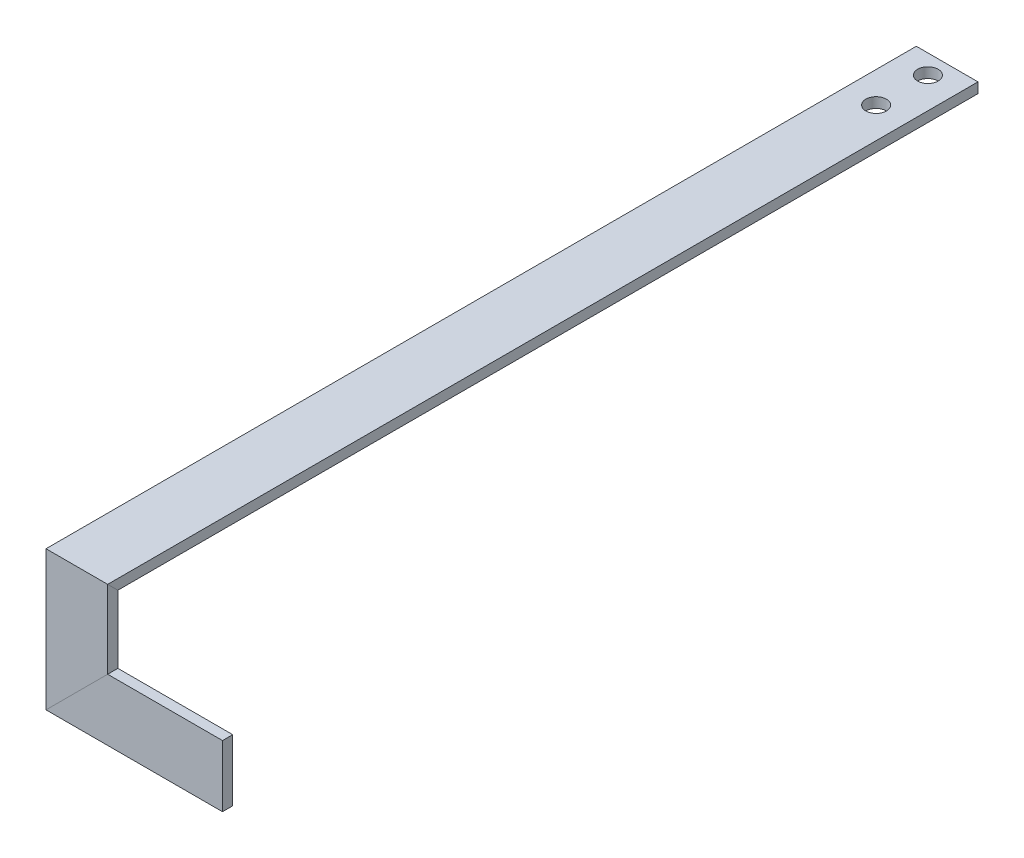
ISO-10303-21;
HEADER;
FILE_DESCRIPTION(('STEP AP214'),'2;1');
FILE_NAME('part.step','',(''),(''),'','','');
FILE_SCHEMA(('AUTOMOTIVE_DESIGN { 1 0 10303 214 1 1 1 1 }'));
ENDSEC;
DATA;
#1=APPLICATION_CONTEXT('core data for automotive mechanical design processes');
#2=APPLICATION_PROTOCOL_DEFINITION('international standard','automotive_design',2000,#1);
#3=PRODUCT_CONTEXT('',#1,'mechanical');
#4=PRODUCT('Part','Part','',(#3));
#5=PRODUCT_RELATED_PRODUCT_CATEGORY('part','',(#4));
#6=PRODUCT_DEFINITION_FORMATION('','',#4);
#7=PRODUCT_DEFINITION_CONTEXT('part definition',#1,'design');
#8=PRODUCT_DEFINITION('design','',#6,#7);
#9=PRODUCT_DEFINITION_SHAPE('','',#8);
#10=(LENGTH_UNIT() NAMED_UNIT(*) SI_UNIT(.MILLI.,.METRE.));
#11=(NAMED_UNIT(*) PLANE_ANGLE_UNIT() SI_UNIT($,.RADIAN.));
#12=(NAMED_UNIT(*) SI_UNIT($,.STERADIAN.) SOLID_ANGLE_UNIT());
#13=UNCERTAINTY_MEASURE_WITH_UNIT(LENGTH_MEASURE(1.E-05),#10,'distance_accuracy_value','');
#14=(GEOMETRIC_REPRESENTATION_CONTEXT(3) GLOBAL_UNCERTAINTY_ASSIGNED_CONTEXT((#13)) GLOBAL_UNIT_ASSIGNED_CONTEXT((#10,
#11,#12)) REPRESENTATION_CONTEXT('',''));
#15=CARTESIAN_POINT('',(0.,0.,0.));
#16=DIRECTION('',(0.,0.,1.));
#17=DIRECTION('',(1.,0.,0.));
#18=AXIS2_PLACEMENT_3D('',#15,#16,#17);
#19=CARTESIAN_POINT('',(90.,-64.,534.55));
#20=DIRECTION('',(1.,0.,0.));
#21=DIRECTION('',(0.,1.,0.));
#22=AXIS2_PLACEMENT_3D('',#19,#20,#21);
#23=PLANE('',#22);
#24=DIRECTION('',(0.,0.,1.));
#25=VECTOR('',#24,1.);
#26=CARTESIAN_POINT('',(90.,-44.95,537.705));
#27=LINE('',#26,#25);
#28=CARTESIAN_POINT('',(90.,-44.95,531.395));
#29=VERTEX_POINT('',#28);
#30=CARTESIAN_POINT('',(90.,-44.95,537.705));
#31=VERTEX_POINT('',#30);
#32=EDGE_CURVE('E88',#29,#31,#27,.T.);
#33=ORIENTED_EDGE('',*,*,#32,.T.);
#34=DIRECTION('',(0.,-1.,0.));
#35=VECTOR('',#34,1.);
#36=CARTESIAN_POINT('',(90.,-83.05,537.705));
#37=LINE('',#36,#35);
#38=CARTESIAN_POINT('',(90.,-83.05,537.705));
#39=VERTEX_POINT('',#38);
#40=EDGE_CURVE('E86',#31,#39,#37,.T.);
#41=ORIENTED_EDGE('',*,*,#40,.T.);
#42=DIRECTION('',(0.,0.,-1.));
#43=VECTOR('',#42,1.);
#44=CARTESIAN_POINT('',(90.,-83.05,537.705));
#45=LINE('',#44,#43);
#46=CARTESIAN_POINT('',(90.,-83.05,531.395));
#47=VERTEX_POINT('',#46);
#48=EDGE_CURVE('E83',#39,#47,#45,.T.);
#49=ORIENTED_EDGE('',*,*,#48,.T.);
#50=DIRECTION('',(0.,1.,0.));
#51=VECTOR('',#50,1.);
#52=CARTESIAN_POINT('',(90.,-83.05,531.395));
#53=LINE('',#52,#51);
#54=EDGE_CURVE('E103',#47,#29,#53,.T.);
#55=ORIENTED_EDGE('',*,*,#54,.T.);
#56=EDGE_LOOP('',(#33,#41,#49,#55));
#57=FACE_BOUND('',#56,.T.);
#58=ADVANCED_FACE('F37',(#57),#23,.T.);
#59=CARTESIAN_POINT('',(0.,0.,0.));
#60=DIRECTION('',(0.,0.,1.));
#61=DIRECTION('',(1.,0.,0.));
#62=AXIS2_PLACEMENT_3D('',#59,#60,#61);
#63=PLANE('',#62);
#64=DIRECTION('',(0.,1.,0.));
#65=VECTOR('',#64,1.);
#66=CARTESIAN_POINT('',(19.05,3.155,0.));
#67=LINE('',#66,#65);
#68=CARTESIAN_POINT('',(19.05,-3.155,0.));
#69=VERTEX_POINT('',#68);
#70=CARTESIAN_POINT('',(19.05,3.155,0.));
#71=VERTEX_POINT('',#70);
#72=EDGE_CURVE('E145',#69,#71,#67,.T.);
#73=ORIENTED_EDGE('',*,*,#72,.F.);
#74=DIRECTION('',(1.,0.,0.));
#75=VECTOR('',#74,1.);
#76=CARTESIAN_POINT('',(-19.05,-3.155,0.));
#77=LINE('',#76,#75);
#78=CARTESIAN_POINT('',(-19.05,-3.155,0.));
#79=VERTEX_POINT('',#78);
#80=EDGE_CURVE('E151',#79,#69,#77,.T.);
#81=ORIENTED_EDGE('',*,*,#80,.F.);
#82=DIRECTION('',(0.,-1.,0.));
#83=VECTOR('',#82,1.);
#84=CARTESIAN_POINT('',(-19.05,3.155,0.));
#85=LINE('',#84,#83);
#86=CARTESIAN_POINT('',(-19.05,3.155,0.));
#87=VERTEX_POINT('',#86);
#88=EDGE_CURVE('E135',#87,#79,#85,.T.);
#89=ORIENTED_EDGE('',*,*,#88,.F.);
#90=DIRECTION('',(-1.,0.,0.));
#91=VECTOR('',#90,1.);
#92=CARTESIAN_POINT('',(-19.05,3.155,0.));
#93=LINE('',#92,#91);
#94=EDGE_CURVE('E141',#71,#87,#93,.T.);
#95=ORIENTED_EDGE('',*,*,#94,.F.);
#96=EDGE_LOOP('',(#73,#81,#89,#95));
#97=FACE_BOUND('',#96,.T.);
#98=ADVANCED_FACE('F358',(#97),#63,.F.);
#99=CARTESIAN_POINT('',(-21.055,-83.05,537.705));
#100=DIRECTION('',(0.,-1.,0.));
#101=DIRECTION('',(0.,0.,-1.));
#102=AXIS2_PLACEMENT_3D('',#99,#100,#101);
#103=PLANE('',#102);
#104=DIRECTION('',(0.,0.,1.));
#105=VECTOR('',#104,1.);
#106=CARTESIAN_POINT('',(-19.05,-83.05,537.705));
#107=LINE('',#106,#105);
#108=CARTESIAN_POINT('',(-19.05,-83.05,531.395));
#109=VERTEX_POINT('',#108);
#110=CARTESIAN_POINT('',(-19.05,-83.05,537.705));
#111=VERTEX_POINT('',#110);
#112=EDGE_CURVE('E119',#109,#111,#107,.T.);
#113=ORIENTED_EDGE('',*,*,#112,.F.);
#114=DIRECTION('',(1.,0.,0.));
#115=VECTOR('',#114,1.);
#116=CARTESIAN_POINT('',(-21.055,-83.05,531.395));
#117=LINE('',#116,#115);
#118=EDGE_CURVE('E101',#109,#47,#117,.T.);
#119=ORIENTED_EDGE('',*,*,#118,.T.);
#120=ORIENTED_EDGE('',*,*,#48,.F.);
#121=DIRECTION('',(1.,0.,0.));
#122=VECTOR('',#121,1.);
#123=CARTESIAN_POINT('',(-21.055,-83.05,537.705));
#124=LINE('',#123,#122);
#125=EDGE_CURVE('E40',#111,#39,#124,.T.);
#126=ORIENTED_EDGE('',*,*,#125,.F.);
#127=EDGE_LOOP('',(#113,#119,#120,#126));
#128=FACE_BOUND('',#127,.T.);
#129=ADVANCED_FACE('F98',(#128),#103,.T.);
#130=CARTESIAN_POINT('',(-21.055,-83.05,531.395));
#131=DIRECTION('',(0.,0.,-1.));
#132=DIRECTION('',(-1.,0.,0.));
#133=AXIS2_PLACEMENT_3D('',#130,#131,#132);
#134=PLANE('',#133);
#135=DIRECTION('',(-0.707106781186548,-0.707106781186548,0.));
#136=VECTOR('',#135,1.);
#137=CARTESIAN_POINT('',(24.2602499999999,-39.73975,531.395));
#138=LINE('',#137,#136);
#139=CARTESIAN_POINT('',(19.05,-44.95,531.395));
#140=VERTEX_POINT('',#139);
#141=EDGE_CURVE('E132',#140,#109,#138,.T.);
#142=ORIENTED_EDGE('',*,*,#141,.F.);
#143=DIRECTION('',(1.,0.,0.));
#144=VECTOR('',#143,1.);
#145=CARTESIAN_POINT('',(-21.055,-44.95,531.395));
#146=LINE('',#145,#144);
#147=EDGE_CURVE('E112',#140,#29,#146,.T.);
#148=ORIENTED_EDGE('',*,*,#147,.T.);
#149=ORIENTED_EDGE('',*,*,#54,.F.);
#150=ORIENTED_EDGE('',*,*,#118,.F.);
#151=EDGE_LOOP('',(#142,#148,#149,#150));
#152=FACE_BOUND('',#151,.T.);
#153=ADVANCED_FACE('F339',(#152),#134,.T.);
#154=CARTESIAN_POINT('',(-21.055,-44.95,537.705));
#155=DIRECTION('',(0.,1.,0.));
#156=DIRECTION('',(0.,0.,1.));
#157=AXIS2_PLACEMENT_3D('',#154,#155,#156);
#158=PLANE('',#157);
#159=DIRECTION('',(0.,0.,-1.));
#160=VECTOR('',#159,1.);
#161=CARTESIAN_POINT('',(19.05,-44.95,537.705));
#162=LINE('',#161,#160);
#163=CARTESIAN_POINT('',(19.05,-44.95,537.705));
#164=VERTEX_POINT('',#163);
#165=EDGE_CURVE('E129',#164,#140,#162,.T.);
#166=ORIENTED_EDGE('',*,*,#165,.F.);
#167=DIRECTION('',(1.,0.,0.));
#168=VECTOR('',#167,1.);
#169=CARTESIAN_POINT('',(-21.055,-44.95,537.705));
#170=LINE('',#169,#168);
#171=EDGE_CURVE('E102',#164,#31,#170,.T.);
#172=ORIENTED_EDGE('',*,*,#171,.T.);
#173=ORIENTED_EDGE('',*,*,#32,.F.);
#174=ORIENTED_EDGE('',*,*,#147,.F.);
#175=EDGE_LOOP('',(#166,#172,#173,#174));
#176=FACE_BOUND('',#175,.T.);
#177=ADVANCED_FACE('F236',(#176),#158,.T.);
#178=CARTESIAN_POINT('',(-21.055,-83.05,537.705));
#179=DIRECTION('',(0.,0.,1.));
#180=DIRECTION('',(1.,0.,0.));
#181=AXIS2_PLACEMENT_3D('',#178,#179,#180);
#182=PLANE('',#181);
#183=DIRECTION('',(0.707106781186548,0.707106781186548,0.));
#184=VECTOR('',#183,1.);
#185=CARTESIAN_POINT('',(24.2602499999999,-39.73975,537.705));
#186=LINE('',#185,#184);
#187=EDGE_CURVE('E107',#111,#164,#186,.T.);
#188=ORIENTED_EDGE('',*,*,#187,.F.);
#189=ORIENTED_EDGE('',*,*,#125,.T.);
#190=ORIENTED_EDGE('',*,*,#40,.F.);
#191=ORIENTED_EDGE('',*,*,#171,.F.);
#192=EDGE_LOOP('',(#188,#189,#190,#191));
#193=FACE_BOUND('',#192,.T.);
#194=ADVANCED_FACE('F105',(#193),#182,.T.);
#195=CARTESIAN_POINT('',(-19.05,3.5704999999999,537.705));
#196=DIRECTION('',(0.,0.,1.));
#197=DIRECTION('',(1.,0.,0.));
#198=AXIS2_PLACEMENT_3D('',#195,#196,#197);
#199=PLANE('',#198);
#200=DIRECTION('',(0.,-1.,0.));
#201=VECTOR('',#200,1.);
#202=CARTESIAN_POINT('',(-19.05,3.5704999999999,537.705));
#203=LINE('',#202,#201);
#204=CARTESIAN_POINT('',(-19.05,3.15499999999998,537.705));
#205=VERTEX_POINT('',#204);
#206=EDGE_CURVE('E121',#205,#111,#203,.T.);
#207=ORIENTED_EDGE('',*,*,#206,.T.);
#208=ORIENTED_EDGE('',*,*,#187,.T.);
#209=DIRECTION('',(0.,-1.,0.));
#210=VECTOR('',#209,1.);
#211=CARTESIAN_POINT('',(19.05,3.5704999999999,537.705));
#212=LINE('',#211,#210);
#213=CARTESIAN_POINT('',(19.05,3.15499999999998,537.705));
#214=VERTEX_POINT('',#213);
#215=EDGE_CURVE('E108',#214,#164,#212,.T.);
#216=ORIENTED_EDGE('',*,*,#215,.F.);
#217=DIRECTION('',(1.,0.,0.));
#218=VECTOR('',#217,1.);
#219=CARTESIAN_POINT('',(-19.05,3.155,537.705));
#220=LINE('',#219,#218);
#221=EDGE_CURVE('E139',#205,#214,#220,.T.);
#222=ORIENTED_EDGE('',*,*,#221,.F.);
#223=EDGE_LOOP('',(#207,#208,#216,#222));
#224=FACE_BOUND('',#223,.T.);
#225=ADVANCED_FACE('F228',(#224),#199,.T.);
#226=CARTESIAN_POINT('',(19.05,3.5704999999999,537.705));
#227=DIRECTION('',(1.,0.,0.));
#228=DIRECTION('',(0.,0.,-1.));
#229=AXIS2_PLACEMENT_3D('',#226,#227,#228);
#230=PLANE('',#229);
#231=ORIENTED_EDGE('',*,*,#215,.T.);
#232=ORIENTED_EDGE('',*,*,#165,.T.);
#233=DIRECTION('',(0.,-1.,0.));
#234=VECTOR('',#233,1.);
#235=CARTESIAN_POINT('',(19.05,3.5704999999999,531.395));
#236=LINE('',#235,#234);
#237=CARTESIAN_POINT('',(19.05,-3.15500000000006,531.395));
#238=VERTEX_POINT('',#237);
#239=EDGE_CURVE('E110',#238,#140,#236,.T.);
#240=ORIENTED_EDGE('',*,*,#239,.F.);
#241=DIRECTION('',(0.,-0.707106781186548,-0.707106781186548));
#242=VECTOR('',#241,1.);
#243=CARTESIAN_POINT('',(19.05,-265.6975,268.8525));
#244=LINE('',#243,#242);
#245=EDGE_CURVE('E46',#214,#238,#244,.T.);
#246=ORIENTED_EDGE('',*,*,#245,.F.);
#247=EDGE_LOOP('',(#231,#232,#240,#246));
#248=FACE_BOUND('',#247,.T.);
#249=ADVANCED_FACE('F226',(#248),#230,.T.);
#250=CARTESIAN_POINT('',(-19.05,3.5704999999999,531.395));
#251=DIRECTION('',(0.,0.,-1.));
#252=DIRECTION('',(-1.,0.,0.));
#253=AXIS2_PLACEMENT_3D('',#250,#251,#252);
#254=PLANE('',#253);
#255=ORIENTED_EDGE('',*,*,#239,.T.);
#256=ORIENTED_EDGE('',*,*,#141,.T.);
#257=DIRECTION('',(0.,-1.,0.));
#258=VECTOR('',#257,1.);
#259=CARTESIAN_POINT('',(-19.05,3.5704999999999,531.395));
#260=LINE('',#259,#258);
#261=CARTESIAN_POINT('',(-19.05,-3.15500000000006,531.395));
#262=VERTEX_POINT('',#261);
#263=EDGE_CURVE('E124',#262,#109,#260,.T.);
#264=ORIENTED_EDGE('',*,*,#263,.F.);
#265=DIRECTION('',(-1.,0.,0.));
#266=VECTOR('',#265,1.);
#267=CARTESIAN_POINT('',(-19.05,-3.155,531.395));
#268=LINE('',#267,#266);
#269=EDGE_CURVE('E11',#238,#262,#268,.T.);
#270=ORIENTED_EDGE('',*,*,#269,.F.);
#271=EDGE_LOOP('',(#255,#256,#264,#270));
#272=FACE_BOUND('',#271,.T.);
#273=ADVANCED_FACE('F220',(#272),#254,.T.);
#274=CARTESIAN_POINT('',(-19.05,3.5704999999999,537.705));
#275=DIRECTION('',(-1.,0.,0.));
#276=DIRECTION('',(0.,0.,1.));
#277=AXIS2_PLACEMENT_3D('',#274,#275,#276);
#278=PLANE('',#277);
#279=ORIENTED_EDGE('',*,*,#263,.T.);
#280=ORIENTED_EDGE('',*,*,#112,.T.);
#281=ORIENTED_EDGE('',*,*,#206,.F.);
#282=DIRECTION('',(0.,0.707106781186548,0.707106781186548));
#283=VECTOR('',#282,1.);
#284=CARTESIAN_POINT('',(-19.05,-265.6975,268.8525));
#285=LINE('',#284,#283);
#286=EDGE_CURVE('E136',#262,#205,#285,.T.);
#287=ORIENTED_EDGE('',*,*,#286,.F.);
#288=EDGE_LOOP('',(#279,#280,#281,#287));
#289=FACE_BOUND('',#288,.T.);
#290=ADVANCED_FACE('F193',(#289),#278,.T.);
#291=CARTESIAN_POINT('',(-19.05,3.155,0.));
#292=DIRECTION('',(0.,1.,0.));
#293=DIRECTION('',(0.,0.,1.));
#294=AXIS2_PLACEMENT_3D('',#291,#292,#293);
#295=PLANE('',#294);
#296=CARTESIAN_POINT('',(6.52256026967279E-12,3.155,11.8922046657244));
#297=DIRECTION('',(0.,1.,0.));
#298=DIRECTION('',(0.,0.,1.));
#299=AXIS2_PLACEMENT_3D('',#296,#297,#298);
#300=CIRCLE('',#299,6.35000000000004);
#301=CARTESIAN_POINT('',(6.52256026967279E-12,3.155,18.2422046657244));
#302=VERTEX_POINT('',#301);
#303=EDGE_CURVE('E173',#302,#302,#300,.T.);
#304=ORIENTED_EDGE('',*,*,#303,.F.);
#305=EDGE_LOOP('',(#304));
#306=FACE_BOUND('',#305,.T.);
#307=CARTESIAN_POINT('',(6.64746035994312E-12,3.155,43.8922046657244));
#308=DIRECTION('',(0.,1.,0.));
#309=DIRECTION('',(0.,0.,1.));
#310=AXIS2_PLACEMENT_3D('',#307,#308,#309);
#311=CIRCLE('',#310,6.35000000000007);
#312=CARTESIAN_POINT('',(6.64746035994312E-12,3.155,50.2422046657245));
#313=VERTEX_POINT('',#312);
#314=EDGE_CURVE('E167',#313,#313,#311,.T.);
#315=ORIENTED_EDGE('',*,*,#314,.F.);
#316=EDGE_LOOP('',(#315));
#317=FACE_BOUND('',#316,.T.);
#318=DIRECTION('',(0.,0.,1.));
#319=VECTOR('',#318,1.);
#320=CARTESIAN_POINT('',(-19.05,3.155,0.));
#321=LINE('',#320,#319);
#322=EDGE_CURVE('E144',#87,#205,#321,.T.);
#323=ORIENTED_EDGE('',*,*,#322,.T.);
#324=ORIENTED_EDGE('',*,*,#221,.T.);
#325=DIRECTION('',(0.,0.,1.));
#326=VECTOR('',#325,1.);
#327=CARTESIAN_POINT('',(19.05,3.155,0.));
#328=LINE('',#327,#326);
#329=EDGE_CURVE('E140',#71,#214,#328,.T.);
#330=ORIENTED_EDGE('',*,*,#329,.F.);
#331=ORIENTED_EDGE('',*,*,#94,.T.);
#332=EDGE_LOOP('',(#323,#324,#330,#331));
#333=FACE_BOUND('',#332,.T.);
#334=ADVANCED_FACE('F189',(#306,#317,#333),#295,.T.);
#335=CARTESIAN_POINT('',(19.05,3.155,0.));
#336=DIRECTION('',(1.,0.,0.));
#337=DIRECTION('',(0.,0.,-1.));
#338=AXIS2_PLACEMENT_3D('',#335,#336,#337);
#339=PLANE('',#338);
#340=ORIENTED_EDGE('',*,*,#329,.T.);
#341=ORIENTED_EDGE('',*,*,#245,.T.);
#342=DIRECTION('',(0.,0.,1.));
#343=VECTOR('',#342,1.);
#344=CARTESIAN_POINT('',(19.05,-3.155,0.));
#345=LINE('',#344,#343);
#346=EDGE_CURVE('E148',#69,#238,#345,.T.);
#347=ORIENTED_EDGE('',*,*,#346,.F.);
#348=ORIENTED_EDGE('',*,*,#72,.T.);
#349=EDGE_LOOP('',(#340,#341,#347,#348));
#350=FACE_BOUND('',#349,.T.);
#351=ADVANCED_FACE('F192',(#350),#339,.T.);
#352=CARTESIAN_POINT('',(-19.05,-3.155,0.));
#353=DIRECTION('',(0.,-1.,0.));
#354=DIRECTION('',(0.,0.,-1.));
#355=AXIS2_PLACEMENT_3D('',#352,#353,#354);
#356=PLANE('',#355);
#357=CARTESIAN_POINT('',(6.52256026967279E-12,-3.155,11.8922046657244));
#358=DIRECTION('',(0.,1.,0.));
#359=DIRECTION('',(0.,0.,1.));
#360=AXIS2_PLACEMENT_3D('',#357,#358,#359);
#361=CIRCLE('',#360,6.35000000000004);
#362=CARTESIAN_POINT('',(6.52256026967279E-12,-3.155,18.2422046657244));
#363=VERTEX_POINT('',#362);
#364=EDGE_CURVE('E170',#363,#363,#361,.T.);
#365=ORIENTED_EDGE('',*,*,#364,.T.);
#366=EDGE_LOOP('',(#365));
#367=FACE_BOUND('',#366,.T.);
#368=CARTESIAN_POINT('',(6.64746035994312E-12,-3.155,43.8922046657244));
#369=DIRECTION('',(0.,1.,0.));
#370=DIRECTION('',(0.,0.,1.));
#371=AXIS2_PLACEMENT_3D('',#368,#369,#370);
#372=CIRCLE('',#371,6.35000000000007);
#373=CARTESIAN_POINT('',(6.64746035994312E-12,-3.155,50.2422046657245));
#374=VERTEX_POINT('',#373);
#375=EDGE_CURVE('E93',#374,#374,#372,.T.);
#376=ORIENTED_EDGE('',*,*,#375,.T.);
#377=EDGE_LOOP('',(#376));
#378=FACE_BOUND('',#377,.T.);
#379=ORIENTED_EDGE('',*,*,#346,.T.);
#380=ORIENTED_EDGE('',*,*,#269,.T.);
#381=DIRECTION('',(0.,0.,1.));
#382=VECTOR('',#381,1.);
#383=CARTESIAN_POINT('',(-19.05,-3.155,0.));
#384=LINE('',#383,#382);
#385=EDGE_CURVE('E154',#79,#262,#384,.T.);
#386=ORIENTED_EDGE('',*,*,#385,.F.);
#387=ORIENTED_EDGE('',*,*,#80,.T.);
#388=EDGE_LOOP('',(#379,#380,#386,#387));
#389=FACE_BOUND('',#388,.T.);
#390=ADVANCED_FACE('F179',(#367,#378,#389),#356,.T.);
#391=CARTESIAN_POINT('',(-19.05,3.155,0.));
#392=DIRECTION('',(-1.,0.,0.));
#393=DIRECTION('',(0.,0.,1.));
#394=AXIS2_PLACEMENT_3D('',#391,#392,#393);
#395=PLANE('',#394);
#396=ORIENTED_EDGE('',*,*,#385,.T.);
#397=ORIENTED_EDGE('',*,*,#286,.T.);
#398=ORIENTED_EDGE('',*,*,#322,.F.);
#399=ORIENTED_EDGE('',*,*,#88,.T.);
#400=EDGE_LOOP('',(#396,#397,#398,#399));
#401=FACE_BOUND('',#400,.T.);
#402=ADVANCED_FACE('F203',(#401),#395,.T.);
#403=CARTESIAN_POINT('',(6.64746035994312E-12,-3.155,43.8922046657244));
#404=DIRECTION('',(0.,1.,0.));
#405=DIRECTION('',(0.,0.,1.));
#406=AXIS2_PLACEMENT_3D('',#403,#404,#405);
#407=CYLINDRICAL_SURFACE('',#406,6.35000000000007);
#408=ORIENTED_EDGE('',*,*,#375,.F.);
#409=EDGE_LOOP('',(#408));
#410=FACE_BOUND('',#409,.T.);
#411=ORIENTED_EDGE('',*,*,#314,.T.);
#412=EDGE_LOOP('',(#411));
#413=FACE_BOUND('',#412,.T.);
#414=ADVANCED_FACE('F185',(#410,#413),#407,.F.);
#415=CARTESIAN_POINT('',(6.52256026967279E-12,-3.155,11.8922046657244));
#416=DIRECTION('',(0.,1.,0.));
#417=DIRECTION('',(0.,0.,1.));
#418=AXIS2_PLACEMENT_3D('',#415,#416,#417);
#419=CYLINDRICAL_SURFACE('',#418,6.35000000000004);
#420=ORIENTED_EDGE('',*,*,#364,.F.);
#421=EDGE_LOOP('',(#420));
#422=FACE_BOUND('',#421,.T.);
#423=ORIENTED_EDGE('',*,*,#303,.T.);
#424=EDGE_LOOP('',(#423));
#425=FACE_BOUND('',#424,.T.);
#426=ADVANCED_FACE('F182',(#422,#425),#419,.F.);
#427=CLOSED_SHELL('',(#58,#98,#129,#153,#177,#194,#225,#249,#273,#290,#334,#351,#390,#402,#414,#426));
#428=MANIFOLD_SOLID_BREP('B2',#427);
#429=ADVANCED_BREP_SHAPE_REPRESENTATION('',(#18,#428),#14);
#430=SHAPE_DEFINITION_REPRESENTATION(#9,#429);
ENDSEC;
END-ISO-10303-21;
